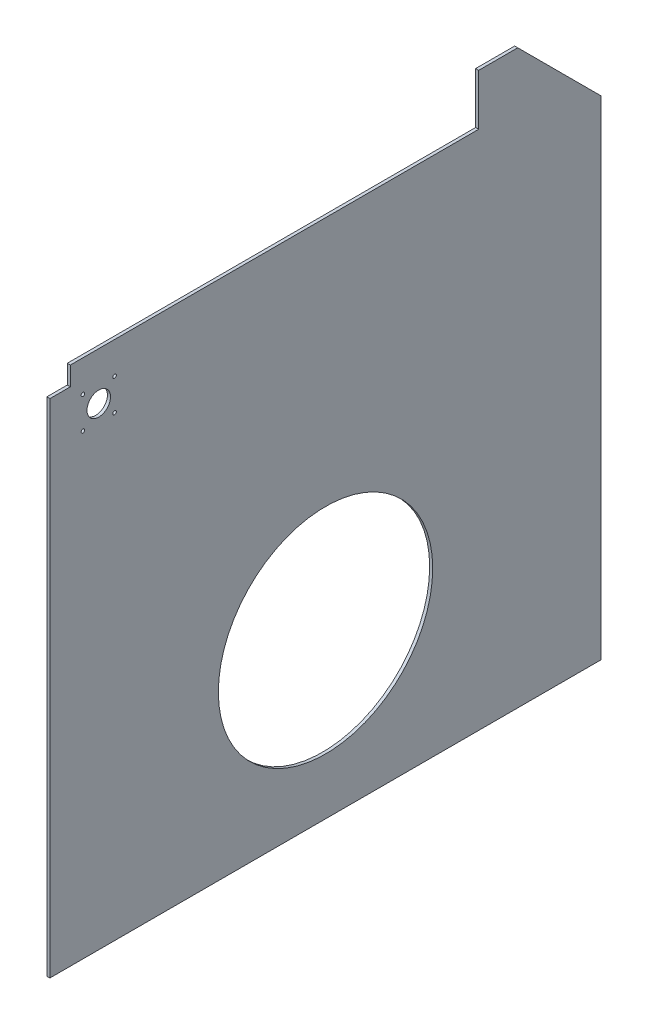
ISO-10303-21;
HEADER;
FILE_DESCRIPTION(('STEP AP214'),'2;1');
FILE_NAME('part.step','',(''),(''),'','','');
FILE_SCHEMA(('AUTOMOTIVE_DESIGN { 1 0 10303 214 1 1 1 1 }'));
ENDSEC;
DATA;
#1=APPLICATION_CONTEXT('core data for automotive mechanical design processes');
#2=APPLICATION_PROTOCOL_DEFINITION('international standard','automotive_design',2000,#1);
#3=PRODUCT_CONTEXT('',#1,'mechanical');
#4=PRODUCT('Part','Part','',(#3));
#5=PRODUCT_RELATED_PRODUCT_CATEGORY('part','',(#4));
#6=PRODUCT_DEFINITION_FORMATION('','',#4);
#7=PRODUCT_DEFINITION_CONTEXT('part definition',#1,'design');
#8=PRODUCT_DEFINITION('design','',#6,#7);
#9=PRODUCT_DEFINITION_SHAPE('','',#8);
#10=(LENGTH_UNIT() NAMED_UNIT(*) SI_UNIT(.MILLI.,.METRE.));
#11=(NAMED_UNIT(*) PLANE_ANGLE_UNIT() SI_UNIT($,.RADIAN.));
#12=(NAMED_UNIT(*) SI_UNIT($,.STERADIAN.) SOLID_ANGLE_UNIT());
#13=UNCERTAINTY_MEASURE_WITH_UNIT(LENGTH_MEASURE(1.E-05),#10,'distance_accuracy_value','');
#14=(GEOMETRIC_REPRESENTATION_CONTEXT(3) GLOBAL_UNCERTAINTY_ASSIGNED_CONTEXT((#13)) GLOBAL_UNIT_ASSIGNED_CONTEXT((#10,
#11,#12)) REPRESENTATION_CONTEXT('',''));
#15=CARTESIAN_POINT('',(0.,0.,0.));
#16=DIRECTION('',(0.,0.,1.));
#17=DIRECTION('',(1.,0.,0.));
#18=AXIS2_PLACEMENT_3D('',#15,#16,#17);
#19=CARTESIAN_POINT('',(3.,0.,0.));
#20=DIRECTION('',(0.,1.,0.));
#21=DIRECTION('',(0.,0.,1.));
#22=AXIS2_PLACEMENT_3D('',#19,#20,#21);
#23=PLANE('',#22);
#24=DIRECTION('',(0.,0.,-1.));
#25=VECTOR('',#24,1.);
#26=CARTESIAN_POINT('',(0.,0.,0.));
#27=LINE('',#26,#25);
#28=CARTESIAN_POINT('',(0.,0.,0.));
#29=VERTEX_POINT('',#28);
#30=CARTESIAN_POINT('',(0.,0.,-540.));
#31=VERTEX_POINT('',#30);
#32=EDGE_CURVE('E141',#29,#31,#27,.T.);
#33=ORIENTED_EDGE('',*,*,#32,.T.);
#34=DIRECTION('',(-1.,0.,0.));
#35=VECTOR('',#34,1.);
#36=CARTESIAN_POINT('',(3.,0.,-540.));
#37=LINE('',#36,#35);
#38=CARTESIAN_POINT('',(3.,0.,-540.));
#39=VERTEX_POINT('',#38);
#40=EDGE_CURVE('E42',#39,#31,#37,.T.);
#41=ORIENTED_EDGE('',*,*,#40,.F.);
#42=DIRECTION('',(0.,0.,-1.));
#43=VECTOR('',#42,1.);
#44=CARTESIAN_POINT('',(3.,0.,0.));
#45=LINE('',#44,#43);
#46=CARTESIAN_POINT('',(3.,0.,0.));
#47=VERTEX_POINT('',#46);
#48=EDGE_CURVE('E98',#47,#39,#45,.T.);
#49=ORIENTED_EDGE('',*,*,#48,.F.);
#50=DIRECTION('',(-1.,0.,0.));
#51=VECTOR('',#50,1.);
#52=CARTESIAN_POINT('',(3.,0.,0.));
#53=LINE('',#52,#51);
#54=EDGE_CURVE('E11',#47,#29,#53,.T.);
#55=ORIENTED_EDGE('',*,*,#54,.T.);
#56=EDGE_LOOP('',(#33,#41,#49,#55));
#57=FACE_BOUND('',#56,.T.);
#58=ADVANCED_FACE('F33',(#57),#23,.F.);
#59=CARTESIAN_POINT('',(3.,475.62948055322,-540.));
#60=DIRECTION('',(0.,0.,1.));
#61=DIRECTION('',(1.,0.,0.));
#62=AXIS2_PLACEMENT_3D('',#59,#60,#61);
#63=PLANE('',#62);
#64=DIRECTION('',(0.,1.,0.));
#65=VECTOR('',#64,1.);
#66=CARTESIAN_POINT('',(0.,475.62948055322,-540.));
#67=LINE('',#66,#65);
#68=CARTESIAN_POINT('',(0.,478.284271247462,-540.));
#69=VERTEX_POINT('',#68);
#70=EDGE_CURVE('E144',#31,#69,#67,.T.);
#71=ORIENTED_EDGE('',*,*,#70,.T.);
#72=DIRECTION('',(-1.,0.,0.));
#73=VECTOR('',#72,1.);
#74=CARTESIAN_POINT('',(3.,478.284271247462,-540.));
#75=LINE('',#74,#73);
#76=CARTESIAN_POINT('',(3.,478.284271247462,-540.));
#77=VERTEX_POINT('',#76);
#78=EDGE_CURVE('E167',#77,#69,#75,.T.);
#79=ORIENTED_EDGE('',*,*,#78,.F.);
#80=DIRECTION('',(0.,1.,0.));
#81=VECTOR('',#80,1.);
#82=CARTESIAN_POINT('',(3.,0.,-540.));
#83=LINE('',#82,#81);
#84=EDGE_CURVE('E204',#39,#77,#83,.T.);
#85=ORIENTED_EDGE('',*,*,#84,.F.);
#86=ORIENTED_EDGE('',*,*,#40,.T.);
#87=EDGE_LOOP('',(#71,#79,#85,#86));
#88=FACE_BOUND('',#87,.T.);
#89=ADVANCED_FACE('F228',(#88),#63,.F.);
#90=CARTESIAN_POINT('',(3.,478.284271247462,-540.));
#91=DIRECTION('',(0.,-0.707106781186548,0.707106781186547));
#92=DIRECTION('',(0.,-0.707106781186547,-0.707106781186548));
#93=AXIS2_PLACEMENT_3D('',#90,#91,#92);
#94=PLANE('',#93);
#95=DIRECTION('',(0.,0.707106781186547,0.707106781186548));
#96=VECTOR('',#95,1.);
#97=CARTESIAN_POINT('',(0.,478.284271247462,-540.));
#98=LINE('',#97,#96);
#99=CARTESIAN_POINT('',(0.,560.,-458.284271247462));
#100=VERTEX_POINT('',#99);
#101=EDGE_CURVE('E147',#69,#100,#98,.T.);
#102=ORIENTED_EDGE('',*,*,#101,.T.);
#103=DIRECTION('',(-1.,0.,0.));
#104=VECTOR('',#103,1.);
#105=CARTESIAN_POINT('',(3.,560.,-458.284271247462));
#106=LINE('',#105,#104);
#107=CARTESIAN_POINT('',(3.,560.,-458.284271247462));
#108=VERTEX_POINT('',#107);
#109=EDGE_CURVE('E164',#108,#100,#106,.T.);
#110=ORIENTED_EDGE('',*,*,#109,.F.);
#111=DIRECTION('',(0.,0.707106781186547,0.707106781186548));
#112=VECTOR('',#111,1.);
#113=CARTESIAN_POINT('',(3.,478.284271247462,-540.));
#114=LINE('',#113,#112);
#115=EDGE_CURVE('E206',#77,#108,#114,.T.);
#116=ORIENTED_EDGE('',*,*,#115,.F.);
#117=ORIENTED_EDGE('',*,*,#78,.T.);
#118=EDGE_LOOP('',(#102,#110,#116,#117));
#119=FACE_BOUND('',#118,.T.);
#120=ADVANCED_FACE('F231',(#119),#94,.F.);
#121=CARTESIAN_POINT('',(3.,560.,-458.284271247462));
#122=DIRECTION('',(0.,-1.,0.));
#123=DIRECTION('',(0.,0.,-1.));
#124=AXIS2_PLACEMENT_3D('',#121,#122,#123);
#125=PLANE('',#124);
#126=DIRECTION('',(0.,0.,1.));
#127=VECTOR('',#126,1.);
#128=CARTESIAN_POINT('',(0.,560.,-458.284271247462));
#129=LINE('',#128,#127);
#130=CARTESIAN_POINT('',(0.,560.,-420.));
#131=VERTEX_POINT('',#130);
#132=EDGE_CURVE('E149',#100,#131,#129,.T.);
#133=ORIENTED_EDGE('',*,*,#132,.T.);
#134=DIRECTION('',(-1.,0.,0.));
#135=VECTOR('',#134,1.);
#136=CARTESIAN_POINT('',(3.,560.,-420.));
#137=LINE('',#136,#135);
#138=CARTESIAN_POINT('',(3.,560.,-420.));
#139=VERTEX_POINT('',#138);
#140=EDGE_CURVE('E161',#139,#131,#137,.T.);
#141=ORIENTED_EDGE('',*,*,#140,.F.);
#142=DIRECTION('',(0.,0.,1.));
#143=VECTOR('',#142,1.);
#144=CARTESIAN_POINT('',(3.,560.,-458.284271247462));
#145=LINE('',#144,#143);
#146=EDGE_CURVE('E208',#108,#139,#145,.T.);
#147=ORIENTED_EDGE('',*,*,#146,.F.);
#148=ORIENTED_EDGE('',*,*,#109,.T.);
#149=EDGE_LOOP('',(#133,#141,#147,#148));
#150=FACE_BOUND('',#149,.T.);
#151=ADVANCED_FACE('F214',(#150),#125,.F.);
#152=CARTESIAN_POINT('',(3.,560.,-420.));
#153=DIRECTION('',(0.,0.,-1.));
#154=DIRECTION('',(-1.,0.,0.));
#155=AXIS2_PLACEMENT_3D('',#152,#153,#154);
#156=PLANE('',#155);
#157=DIRECTION('',(0.,-1.,0.));
#158=VECTOR('',#157,1.);
#159=CARTESIAN_POINT('',(0.,560.,-420.));
#160=LINE('',#159,#158);
#161=CARTESIAN_POINT('',(0.,510.,-420.));
#162=VERTEX_POINT('',#161);
#163=EDGE_CURVE('E151',#131,#162,#160,.T.);
#164=ORIENTED_EDGE('',*,*,#163,.T.);
#165=DIRECTION('',(-1.,0.,0.));
#166=VECTOR('',#165,1.);
#167=CARTESIAN_POINT('',(3.,510.,-420.));
#168=LINE('',#167,#166);
#169=CARTESIAN_POINT('',(3.,510.,-420.));
#170=VERTEX_POINT('',#169);
#171=EDGE_CURVE('E130',#170,#162,#168,.T.);
#172=ORIENTED_EDGE('',*,*,#171,.F.);
#173=DIRECTION('',(0.,-1.,0.));
#174=VECTOR('',#173,1.);
#175=CARTESIAN_POINT('',(3.,560.,-420.));
#176=LINE('',#175,#174);
#177=EDGE_CURVE('E121',#139,#170,#176,.T.);
#178=ORIENTED_EDGE('',*,*,#177,.F.);
#179=ORIENTED_EDGE('',*,*,#140,.T.);
#180=EDGE_LOOP('',(#164,#172,#178,#179));
#181=FACE_BOUND('',#180,.T.);
#182=ADVANCED_FACE('F218',(#181),#156,.F.);
#183=CARTESIAN_POINT('',(3.,510.,-420.));
#184=DIRECTION('',(0.,-1.,0.));
#185=DIRECTION('',(0.,0.,-1.));
#186=AXIS2_PLACEMENT_3D('',#183,#184,#185);
#187=PLANE('',#186);
#188=DIRECTION('',(0.,0.,1.));
#189=VECTOR('',#188,1.);
#190=CARTESIAN_POINT('',(0.,510.,-420.));
#191=LINE('',#190,#189);
#192=CARTESIAN_POINT('',(0.,510.,-20.));
#193=VERTEX_POINT('',#192);
#194=EDGE_CURVE('E129',#162,#193,#191,.T.);
#195=ORIENTED_EDGE('',*,*,#194,.T.);
#196=DIRECTION('',(-1.,0.,0.));
#197=VECTOR('',#196,1.);
#198=CARTESIAN_POINT('',(3.,510.,-20.));
#199=LINE('',#198,#197);
#200=CARTESIAN_POINT('',(3.,510.,-20.));
#201=VERTEX_POINT('',#200);
#202=EDGE_CURVE('E126',#201,#193,#199,.T.);
#203=ORIENTED_EDGE('',*,*,#202,.F.);
#204=DIRECTION('',(0.,0.,1.));
#205=VECTOR('',#204,1.);
#206=CARTESIAN_POINT('',(3.,510.,-420.));
#207=LINE('',#206,#205);
#208=EDGE_CURVE('E115',#170,#201,#207,.T.);
#209=ORIENTED_EDGE('',*,*,#208,.F.);
#210=ORIENTED_EDGE('',*,*,#171,.T.);
#211=EDGE_LOOP('',(#195,#203,#209,#210));
#212=FACE_BOUND('',#211,.T.);
#213=ADVANCED_FACE('F127',(#212),#187,.F.);
#214=CARTESIAN_POINT('',(3.,510.,-20.));
#215=DIRECTION('',(0.,0.,-1.));
#216=DIRECTION('',(-1.,0.,0.));
#217=AXIS2_PLACEMENT_3D('',#214,#215,#216);
#218=PLANE('',#217);
#219=DIRECTION('',(0.,-1.,0.));
#220=VECTOR('',#219,1.);
#221=CARTESIAN_POINT('',(0.,510.,-20.));
#222=LINE('',#221,#220);
#223=CARTESIAN_POINT('',(0.,491.519731167299,-20.));
#224=VERTEX_POINT('',#223);
#225=EDGE_CURVE('E84',#193,#224,#222,.T.);
#226=ORIENTED_EDGE('',*,*,#225,.T.);
#227=DIRECTION('',(-1.,0.,0.));
#228=VECTOR('',#227,1.);
#229=CARTESIAN_POINT('',(3.,491.519731167299,-20.));
#230=LINE('',#229,#228);
#231=CARTESIAN_POINT('',(3.,491.519731167299,-20.));
#232=VERTEX_POINT('',#231);
#233=EDGE_CURVE('E131',#232,#224,#230,.T.);
#234=ORIENTED_EDGE('',*,*,#233,.F.);
#235=DIRECTION('',(0.,-1.,0.));
#236=VECTOR('',#235,1.);
#237=CARTESIAN_POINT('',(3.,510.,-20.));
#238=LINE('',#237,#236);
#239=EDGE_CURVE('E119',#201,#232,#238,.T.);
#240=ORIENTED_EDGE('',*,*,#239,.F.);
#241=ORIENTED_EDGE('',*,*,#202,.T.);
#242=EDGE_LOOP('',(#226,#234,#240,#241));
#243=FACE_BOUND('',#242,.T.);
#244=ADVANCED_FACE('F133',(#243),#218,.F.);
#245=CARTESIAN_POINT('',(3.,491.519731167299,-20.));
#246=DIRECTION('',(0.,-1.,0.));
#247=DIRECTION('',(0.,0.,-1.));
#248=AXIS2_PLACEMENT_3D('',#245,#246,#247);
#249=PLANE('',#248);
#250=DIRECTION('',(0.,0.,1.));
#251=VECTOR('',#250,1.);
#252=CARTESIAN_POINT('',(0.,491.519731167299,-20.));
#253=LINE('',#252,#251);
#254=CARTESIAN_POINT('',(0.,491.519731167299,0.));
#255=VERTEX_POINT('',#254);
#256=EDGE_CURVE('E91',#224,#255,#253,.T.);
#257=ORIENTED_EDGE('',*,*,#256,.T.);
#258=DIRECTION('',(-1.,0.,0.));
#259=VECTOR('',#258,1.);
#260=CARTESIAN_POINT('',(3.,491.519731167299,0.));
#261=LINE('',#260,#259);
#262=CARTESIAN_POINT('',(3.,491.519731167299,0.));
#263=VERTEX_POINT('',#262);
#264=EDGE_CURVE('E137',#263,#255,#261,.T.);
#265=ORIENTED_EDGE('',*,*,#264,.F.);
#266=DIRECTION('',(0.,0.,1.));
#267=VECTOR('',#266,1.);
#268=CARTESIAN_POINT('',(3.,491.519731167299,-20.));
#269=LINE('',#268,#267);
#270=EDGE_CURVE('E135',#232,#263,#269,.T.);
#271=ORIENTED_EDGE('',*,*,#270,.F.);
#272=ORIENTED_EDGE('',*,*,#233,.T.);
#273=EDGE_LOOP('',(#257,#265,#271,#272));
#274=FACE_BOUND('',#273,.T.);
#275=ADVANCED_FACE('F224',(#274),#249,.F.);
#276=CARTESIAN_POINT('',(3.,491.519731167299,0.));
#277=DIRECTION('',(0.,0.,-1.));
#278=DIRECTION('',(0.,1.,0.));
#279=AXIS2_PLACEMENT_3D('',#276,#277,#278);
#280=PLANE('',#279);
#281=DIRECTION('',(0.,-1.,0.));
#282=VECTOR('',#281,1.);
#283=CARTESIAN_POINT('',(0.,491.519731167299,0.));
#284=LINE('',#283,#282);
#285=EDGE_CURVE('E156',#255,#29,#284,.T.);
#286=ORIENTED_EDGE('',*,*,#285,.T.);
#287=ORIENTED_EDGE('',*,*,#54,.F.);
#288=DIRECTION('',(0.,-1.,0.));
#289=VECTOR('',#288,1.);
#290=CARTESIAN_POINT('',(3.,0.,0.));
#291=LINE('',#290,#289);
#292=EDGE_CURVE('E51',#263,#47,#291,.T.);
#293=ORIENTED_EDGE('',*,*,#292,.F.);
#294=ORIENTED_EDGE('',*,*,#264,.T.);
#295=EDGE_LOOP('',(#286,#287,#293,#294));
#296=FACE_BOUND('',#295,.T.);
#297=ADVANCED_FACE('F223',(#296),#280,.F.);
#298=CARTESIAN_POINT('',(3.,0.,0.));
#299=DIRECTION('',(1.,0.,0.));
#300=DIRECTION('',(0.,0.,-1.));
#301=AXIS2_PLACEMENT_3D('',#298,#299,#300);
#302=PLANE('',#301);
#303=CARTESIAN_POINT('',(3.,447.886955629758,-32.3676263011195));
#304=DIRECTION('',(1.,0.,0.));
#305=DIRECTION('',(0.,0.,-1.));
#306=AXIS2_PLACEMENT_3D('',#303,#304,#305);
#307=CIRCLE('',#306,1.74999999999998);
#308=CARTESIAN_POINT('',(3.,447.886955629758,-34.1176263011194));
#309=VERTEX_POINT('',#308);
#310=EDGE_CURVE('E181',#309,#309,#307,.T.);
#311=ORIENTED_EDGE('',*,*,#310,.F.);
#312=EDGE_LOOP('',(#311));
#313=FACE_BOUND('',#312,.T.);
#314=CARTESIAN_POINT('',(3.,447.886955629758,-63.3676263011195));
#315=DIRECTION('',(1.,0.,0.));
#316=DIRECTION('',(0.,0.,-1.));
#317=AXIS2_PLACEMENT_3D('',#314,#315,#316);
#318=CIRCLE('',#317,1.74999999999998);
#319=CARTESIAN_POINT('',(3.,447.886955629758,-65.1176263011195));
#320=VERTEX_POINT('',#319);
#321=EDGE_CURVE('E377',#320,#320,#318,.T.);
#322=ORIENTED_EDGE('',*,*,#321,.F.);
#323=EDGE_LOOP('',(#322));
#324=FACE_BOUND('',#323,.T.);
#325=CARTESIAN_POINT('',(3.,478.886955629758,-63.3676263011195));
#326=DIRECTION('',(1.,0.,0.));
#327=DIRECTION('',(0.,0.,-1.));
#328=AXIS2_PLACEMENT_3D('',#325,#326,#327);
#329=CIRCLE('',#328,1.74999999999998);
#330=CARTESIAN_POINT('',(3.,478.886955629758,-65.1176263011194));
#331=VERTEX_POINT('',#330);
#332=EDGE_CURVE('E380',#331,#331,#329,.T.);
#333=ORIENTED_EDGE('',*,*,#332,.F.);
#334=EDGE_LOOP('',(#333));
#335=FACE_BOUND('',#334,.T.);
#336=CARTESIAN_POINT('',(3.,463.386955629758,-47.8676263011195));
#337=DIRECTION('',(1.,0.,0.));
#338=DIRECTION('',(0.,0.,-1.));
#339=AXIS2_PLACEMENT_3D('',#336,#337,#338);
#340=CIRCLE('',#339,11.5);
#341=CARTESIAN_POINT('',(3.,463.386955629758,-59.3676263011195));
#342=VERTEX_POINT('',#341);
#343=EDGE_CURVE('E196',#342,#342,#340,.T.);
#344=ORIENTED_EDGE('',*,*,#343,.F.);
#345=EDGE_LOOP('',(#344));
#346=FACE_BOUND('',#345,.T.);
#347=CARTESIAN_POINT('',(3.,478.886955629758,-32.3676263011195));
#348=DIRECTION('',(1.,0.,0.));
#349=DIRECTION('',(0.,0.,-1.));
#350=AXIS2_PLACEMENT_3D('',#347,#348,#349);
#351=CIRCLE('',#350,1.74999999999998);
#352=CARTESIAN_POINT('',(3.,478.886955629758,-34.1176263011194));
#353=VERTEX_POINT('',#352);
#354=EDGE_CURVE('E176',#353,#353,#351,.T.);
#355=ORIENTED_EDGE('',*,*,#354,.F.);
#356=EDGE_LOOP('',(#355));
#357=FACE_BOUND('',#356,.T.);
#358=CARTESIAN_POINT('',(3.,160.,-270.));
#359=DIRECTION('',(-1.,0.,0.));
#360=DIRECTION('',(0.,0.,1.));
#361=AXIS2_PLACEMENT_3D('',#358,#359,#360);
#362=CIRCLE('',#361,105.);
#363=CARTESIAN_POINT('',(3.,160.,-165.));
#364=VERTEX_POINT('',#363);
#365=EDGE_CURVE('E145',#364,#364,#362,.T.);
#366=ORIENTED_EDGE('',*,*,#365,.T.);
#367=EDGE_LOOP('',(#366));
#368=FACE_BOUND('',#367,.T.);
#369=ORIENTED_EDGE('',*,*,#292,.T.);
#370=ORIENTED_EDGE('',*,*,#48,.T.);
#371=ORIENTED_EDGE('',*,*,#84,.T.);
#372=ORIENTED_EDGE('',*,*,#115,.T.);
#373=ORIENTED_EDGE('',*,*,#146,.T.);
#374=ORIENTED_EDGE('',*,*,#177,.T.);
#375=ORIENTED_EDGE('',*,*,#208,.T.);
#376=ORIENTED_EDGE('',*,*,#239,.T.);
#377=ORIENTED_EDGE('',*,*,#270,.T.);
#378=EDGE_LOOP('',(#369,#370,#371,#372,#373,#374,#375,#376,#377));
#379=FACE_BOUND('',#378,.T.);
#380=ADVANCED_FACE('F117',(#313,#324,#335,#346,#357,#368,#379),#302,.T.);
#381=CARTESIAN_POINT('',(0.,0.,0.));
#382=DIRECTION('',(1.,0.,0.));
#383=DIRECTION('',(0.,0.,-1.));
#384=AXIS2_PLACEMENT_3D('',#381,#382,#383);
#385=PLANE('',#384);
#386=CARTESIAN_POINT('',(0.,447.886955629758,-32.3676263011195));
#387=DIRECTION('',(1.,0.,0.));
#388=DIRECTION('',(0.,0.,-1.));
#389=AXIS2_PLACEMENT_3D('',#386,#387,#388);
#390=CIRCLE('',#389,1.74999999999998);
#391=CARTESIAN_POINT('',(0.,447.886955629758,-34.1176263011194));
#392=VERTEX_POINT('',#391);
#393=EDGE_CURVE('E36',#392,#392,#390,.T.);
#394=ORIENTED_EDGE('',*,*,#393,.T.);
#395=EDGE_LOOP('',(#394));
#396=FACE_BOUND('',#395,.T.);
#397=CARTESIAN_POINT('',(0.,447.886955629758,-63.3676263011195));
#398=DIRECTION('',(1.,0.,0.));
#399=DIRECTION('',(0.,0.,-1.));
#400=AXIS2_PLACEMENT_3D('',#397,#398,#399);
#401=CIRCLE('',#400,1.74999999999998);
#402=CARTESIAN_POINT('',(0.,447.886955629758,-65.1176263011195));
#403=VERTEX_POINT('',#402);
#404=EDGE_CURVE('E183',#403,#403,#401,.T.);
#405=ORIENTED_EDGE('',*,*,#404,.T.);
#406=EDGE_LOOP('',(#405));
#407=FACE_BOUND('',#406,.T.);
#408=CARTESIAN_POINT('',(0.,478.886955629758,-63.3676263011195));
#409=DIRECTION('',(1.,0.,0.));
#410=DIRECTION('',(0.,0.,-1.));
#411=AXIS2_PLACEMENT_3D('',#408,#409,#410);
#412=CIRCLE('',#411,1.74999999999998);
#413=CARTESIAN_POINT('',(0.,478.886955629758,-65.1176263011194));
#414=VERTEX_POINT('',#413);
#415=EDGE_CURVE('E180',#414,#414,#412,.T.);
#416=ORIENTED_EDGE('',*,*,#415,.T.);
#417=EDGE_LOOP('',(#416));
#418=FACE_BOUND('',#417,.T.);
#419=CARTESIAN_POINT('',(0.,463.386955629758,-47.8676263011195));
#420=DIRECTION('',(1.,0.,0.));
#421=DIRECTION('',(0.,0.,-1.));
#422=AXIS2_PLACEMENT_3D('',#419,#420,#421);
#423=CIRCLE('',#422,11.5);
#424=CARTESIAN_POINT('',(0.,463.386955629758,-59.3676263011195));
#425=VERTEX_POINT('',#424);
#426=EDGE_CURVE('E177',#425,#425,#423,.T.);
#427=ORIENTED_EDGE('',*,*,#426,.T.);
#428=EDGE_LOOP('',(#427));
#429=FACE_BOUND('',#428,.T.);
#430=CARTESIAN_POINT('',(0.,478.886955629758,-32.3676263011195));
#431=DIRECTION('',(1.,0.,0.));
#432=DIRECTION('',(0.,0.,-1.));
#433=AXIS2_PLACEMENT_3D('',#430,#431,#432);
#434=CIRCLE('',#433,1.74999999999998);
#435=CARTESIAN_POINT('',(0.,478.886955629758,-34.1176263011194));
#436=VERTEX_POINT('',#435);
#437=EDGE_CURVE('E172',#436,#436,#434,.T.);
#438=ORIENTED_EDGE('',*,*,#437,.T.);
#439=EDGE_LOOP('',(#438));
#440=FACE_BOUND('',#439,.T.);
#441=CARTESIAN_POINT('',(0.,160.,-270.));
#442=DIRECTION('',(-1.,0.,0.));
#443=DIRECTION('',(0.,0.,1.));
#444=AXIS2_PLACEMENT_3D('',#441,#442,#443);
#445=CIRCLE('',#444,105.);
#446=CARTESIAN_POINT('',(0.,160.,-165.));
#447=VERTEX_POINT('',#446);
#448=EDGE_CURVE('E175',#447,#447,#445,.T.);
#449=ORIENTED_EDGE('',*,*,#448,.F.);
#450=EDGE_LOOP('',(#449));
#451=FACE_BOUND('',#450,.T.);
#452=ORIENTED_EDGE('',*,*,#32,.F.);
#453=ORIENTED_EDGE('',*,*,#285,.F.);
#454=ORIENTED_EDGE('',*,*,#256,.F.);
#455=ORIENTED_EDGE('',*,*,#225,.F.);
#456=ORIENTED_EDGE('',*,*,#194,.F.);
#457=ORIENTED_EDGE('',*,*,#163,.F.);
#458=ORIENTED_EDGE('',*,*,#132,.F.);
#459=ORIENTED_EDGE('',*,*,#101,.F.);
#460=ORIENTED_EDGE('',*,*,#70,.F.);
#461=EDGE_LOOP('',(#452,#453,#454,#455,#456,#457,#458,#459,#460));
#462=FACE_BOUND('',#461,.T.);
#463=ADVANCED_FACE('F221',(#396,#407,#418,#429,#440,#451,#462),#385,.F.);
#464=CARTESIAN_POINT('',(3.,160.,-270.));
#465=DIRECTION('',(-1.,0.,0.));
#466=DIRECTION('',(0.,0.,1.));
#467=AXIS2_PLACEMENT_3D('',#464,#465,#466);
#468=CYLINDRICAL_SURFACE('',#467,105.);
#469=ORIENTED_EDGE('',*,*,#365,.F.);
#470=EDGE_LOOP('',(#469));
#471=FACE_BOUND('',#470,.T.);
#472=ORIENTED_EDGE('',*,*,#448,.T.);
#473=EDGE_LOOP('',(#472));
#474=FACE_BOUND('',#473,.T.);
#475=ADVANCED_FACE('F305',(#471,#474),#468,.F.);
#476=CARTESIAN_POINT('',(-12.,478.886955629758,-32.3676263011195));
#477=DIRECTION('',(1.,0.,0.));
#478=DIRECTION('',(0.,0.,-1.));
#479=AXIS2_PLACEMENT_3D('',#476,#477,#478);
#480=CYLINDRICAL_SURFACE('',#479,1.74999999999998);
#481=ORIENTED_EDGE('',*,*,#354,.T.);
#482=EDGE_LOOP('',(#481));
#483=FACE_BOUND('',#482,.T.);
#484=ORIENTED_EDGE('',*,*,#437,.F.);
#485=EDGE_LOOP('',(#484));
#486=FACE_BOUND('',#485,.T.);
#487=ADVANCED_FACE('F310',(#483,#486),#480,.F.);
#488=CARTESIAN_POINT('',(-12.,463.386955629758,-47.8676263011195));
#489=DIRECTION('',(1.,0.,0.));
#490=DIRECTION('',(0.,0.,-1.));
#491=AXIS2_PLACEMENT_3D('',#488,#489,#490);
#492=CYLINDRICAL_SURFACE('',#491,11.5);
#493=ORIENTED_EDGE('',*,*,#343,.T.);
#494=EDGE_LOOP('',(#493));
#495=FACE_BOUND('',#494,.T.);
#496=ORIENTED_EDGE('',*,*,#426,.F.);
#497=EDGE_LOOP('',(#496));
#498=FACE_BOUND('',#497,.T.);
#499=ADVANCED_FACE('F331',(#495,#498),#492,.F.);
#500=CARTESIAN_POINT('',(-12.,478.886955629758,-63.3676263011195));
#501=DIRECTION('',(1.,0.,0.));
#502=DIRECTION('',(0.,0.,-1.));
#503=AXIS2_PLACEMENT_3D('',#500,#501,#502);
#504=CYLINDRICAL_SURFACE('',#503,1.74999999999998);
#505=ORIENTED_EDGE('',*,*,#332,.T.);
#506=EDGE_LOOP('',(#505));
#507=FACE_BOUND('',#506,.T.);
#508=ORIENTED_EDGE('',*,*,#415,.F.);
#509=EDGE_LOOP('',(#508));
#510=FACE_BOUND('',#509,.T.);
#511=ADVANCED_FACE('F340',(#507,#510),#504,.F.);
#512=CARTESIAN_POINT('',(-12.,447.886955629758,-63.3676263011195));
#513=DIRECTION('',(1.,0.,0.));
#514=DIRECTION('',(0.,0.,-1.));
#515=AXIS2_PLACEMENT_3D('',#512,#513,#514);
#516=CYLINDRICAL_SURFACE('',#515,1.74999999999998);
#517=ORIENTED_EDGE('',*,*,#321,.T.);
#518=EDGE_LOOP('',(#517));
#519=FACE_BOUND('',#518,.T.);
#520=ORIENTED_EDGE('',*,*,#404,.F.);
#521=EDGE_LOOP('',(#520));
#522=FACE_BOUND('',#521,.T.);
#523=ADVANCED_FACE('F350',(#519,#522),#516,.F.);
#524=CARTESIAN_POINT('',(-12.,447.886955629758,-32.3676263011195));
#525=DIRECTION('',(1.,0.,0.));
#526=DIRECTION('',(0.,0.,-1.));
#527=AXIS2_PLACEMENT_3D('',#524,#525,#526);
#528=CYLINDRICAL_SURFACE('',#527,1.74999999999998);
#529=ORIENTED_EDGE('',*,*,#310,.T.);
#530=EDGE_LOOP('',(#529));
#531=FACE_BOUND('',#530,.T.);
#532=ORIENTED_EDGE('',*,*,#393,.F.);
#533=EDGE_LOOP('',(#532));
#534=FACE_BOUND('',#533,.T.);
#535=ADVANCED_FACE('F360',(#531,#534),#528,.F.);
#536=CLOSED_SHELL('',(#58,#89,#120,#151,#182,#213,#244,#275,#297,#380,#463,#475,#487,#499,#511,
#523,#535));
#537=MANIFOLD_SOLID_BREP('B2',#536);
#538=ADVANCED_BREP_SHAPE_REPRESENTATION('',(#18,#537),#14);
#539=SHAPE_DEFINITION_REPRESENTATION(#9,#538);
ENDSEC;
END-ISO-10303-21;
